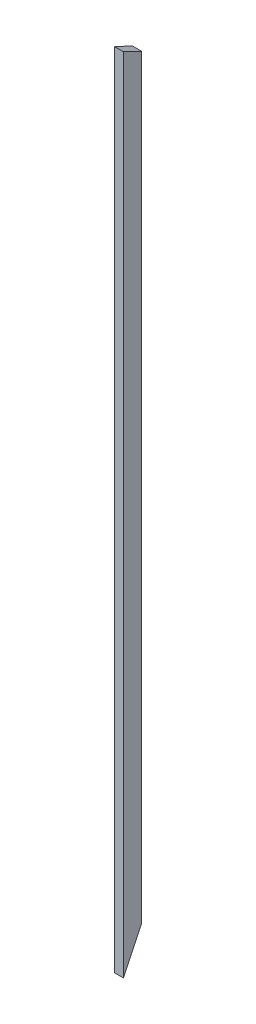
ISO-10303-21;
HEADER;
FILE_DESCRIPTION(('STEP AP214'),'2;1');
FILE_NAME('part.step','',(''),(''),'','','');
FILE_SCHEMA(('AUTOMOTIVE_DESIGN { 1 0 10303 214 1 1 1 1 }'));
ENDSEC;
DATA;
#1=APPLICATION_CONTEXT('core data for automotive mechanical design processes');
#2=APPLICATION_PROTOCOL_DEFINITION('international standard','automotive_design',2000,#1);
#3=PRODUCT_CONTEXT('',#1,'mechanical');
#4=PRODUCT('Part','Part','',(#3));
#5=PRODUCT_RELATED_PRODUCT_CATEGORY('part','',(#4));
#6=PRODUCT_DEFINITION_FORMATION('','',#4);
#7=PRODUCT_DEFINITION_CONTEXT('part definition',#1,'design');
#8=PRODUCT_DEFINITION('design','',#6,#7);
#9=PRODUCT_DEFINITION_SHAPE('','',#8);
#10=(LENGTH_UNIT() NAMED_UNIT(*) SI_UNIT(.MILLI.,.METRE.));
#11=(NAMED_UNIT(*) PLANE_ANGLE_UNIT() SI_UNIT($,.RADIAN.));
#12=(NAMED_UNIT(*) SI_UNIT($,.STERADIAN.) SOLID_ANGLE_UNIT());
#13=UNCERTAINTY_MEASURE_WITH_UNIT(LENGTH_MEASURE(1.E-05),#10,'distance_accuracy_value','');
#14=(GEOMETRIC_REPRESENTATION_CONTEXT(3) GLOBAL_UNCERTAINTY_ASSIGNED_CONTEXT((#13)) GLOBAL_UNIT_ASSIGNED_CONTEXT((#10,
#11,#12)) REPRESENTATION_CONTEXT('',''));
#15=CARTESIAN_POINT('',(0.,0.,0.));
#16=DIRECTION('',(0.,0.,1.));
#17=DIRECTION('',(1.,0.,0.));
#18=AXIS2_PLACEMENT_3D('',#15,#16,#17);
#19=CARTESIAN_POINT('',(-12.5,2214.15898255,-25.));
#20=DIRECTION('',(1.,0.,0.));
#21=DIRECTION('',(0.,0.,-1.));
#22=AXIS2_PLACEMENT_3D('',#19,#20,#21);
#23=PLANE('',#22);
#24=DIRECTION('',(0.,-1.,0.));
#25=VECTOR('',#24,1.);
#26=CARTESIAN_POINT('',(-12.5,2214.15898255,25.));
#27=LINE('',#26,#25);
#28=CARTESIAN_POINT('',(-12.5,2214.15898255,25.));
#29=VERTEX_POINT('',#28);
#30=CARTESIAN_POINT('',(-12.5,0.,25.));
#31=VERTEX_POINT('',#30);
#32=EDGE_CURVE('E11',#29,#31,#27,.T.);
#33=ORIENTED_EDGE('',*,*,#32,.F.);
#34=DIRECTION('',(0.,0.428920235500563,0.903342366757002));
#35=VECTOR('',#34,1.);
#36=CARTESIAN_POINT('',(-12.5,2214.15898255,25.));
#37=LINE('',#36,#35);
#38=CARTESIAN_POINT('',(-12.5,2190.41824751504,-25.));
#39=VERTEX_POINT('',#38);
#40=EDGE_CURVE('E57',#39,#29,#37,.T.);
#41=ORIENTED_EDGE('',*,*,#40,.F.);
#42=DIRECTION('',(0.,-1.,0.));
#43=VECTOR('',#42,1.);
#44=CARTESIAN_POINT('',(-12.5,2214.15898255,-25.));
#45=LINE('',#44,#43);
#46=CARTESIAN_POINT('',(-12.5,105.257973094678,-25.));
#47=VERTEX_POINT('',#46);
#48=EDGE_CURVE('E89',#39,#47,#45,.T.);
#49=ORIENTED_EDGE('',*,*,#48,.T.);
#50=DIRECTION('',(0.,0.903269313435838,-0.429074058182442));
#51=VECTOR('',#50,1.);
#52=CARTESIAN_POINT('',(-12.5,0.,25.));
#53=LINE('',#52,#51);
#54=EDGE_CURVE('E122',#31,#47,#53,.T.);
#55=ORIENTED_EDGE('',*,*,#54,.F.);
#56=EDGE_LOOP('',(#33,#41,#49,#55));
#57=FACE_BOUND('',#56,.T.);
#58=ADVANCED_FACE('F42',(#57),#23,.F.);
#59=CARTESIAN_POINT('',(12.5,2214.15898255,25.));
#60=DIRECTION('',(0.,0.,-1.));
#61=DIRECTION('',(-1.,0.,0.));
#62=AXIS2_PLACEMENT_3D('',#59,#60,#61);
#63=PLANE('',#62);
#64=DIRECTION('',(1.,0.,0.));
#65=VECTOR('',#64,1.);
#66=CARTESIAN_POINT('',(12.5,0.,25.));
#67=LINE('',#66,#65);
#68=CARTESIAN_POINT('',(12.5,0.,25.));
#69=VERTEX_POINT('',#68);
#70=EDGE_CURVE('E104',#31,#69,#67,.T.);
#71=ORIENTED_EDGE('',*,*,#70,.T.);
#72=DIRECTION('',(0.,-1.,0.));
#73=VECTOR('',#72,1.);
#74=CARTESIAN_POINT('',(12.5,2214.15898255,25.));
#75=LINE('',#74,#73);
#76=CARTESIAN_POINT('',(12.5,2214.15898255,25.));
#77=VERTEX_POINT('',#76);
#78=EDGE_CURVE('E51',#77,#69,#75,.T.);
#79=ORIENTED_EDGE('',*,*,#78,.F.);
#80=DIRECTION('',(1.,0.,0.));
#81=VECTOR('',#80,1.);
#82=CARTESIAN_POINT('',(12.5,2214.15898255,25.));
#83=LINE('',#82,#81);
#84=EDGE_CURVE('E99',#29,#77,#83,.T.);
#85=ORIENTED_EDGE('',*,*,#84,.F.);
#86=ORIENTED_EDGE('',*,*,#32,.T.);
#87=EDGE_LOOP('',(#71,#79,#85,#86));
#88=FACE_BOUND('',#87,.T.);
#89=ADVANCED_FACE('F116',(#88),#63,.F.);
#90=CARTESIAN_POINT('',(12.5,2214.15898255,-25.));
#91=DIRECTION('',(-1.,0.,0.));
#92=DIRECTION('',(0.,0.,1.));
#93=AXIS2_PLACEMENT_3D('',#90,#91,#92);
#94=PLANE('',#93);
#95=DIRECTION('',(0.,-1.,0.));
#96=VECTOR('',#95,1.);
#97=CARTESIAN_POINT('',(12.5,2214.15898255,-25.));
#98=LINE('',#97,#96);
#99=CARTESIAN_POINT('',(12.5,2190.41824751504,-25.));
#100=VERTEX_POINT('',#99);
#101=CARTESIAN_POINT('',(12.5,105.257973094678,-25.));
#102=VERTEX_POINT('',#101);
#103=EDGE_CURVE('E98',#100,#102,#98,.T.);
#104=ORIENTED_EDGE('',*,*,#103,.F.);
#105=DIRECTION('',(0.,0.428920235500563,0.903342366757002));
#106=VECTOR('',#105,1.);
#107=CARTESIAN_POINT('',(12.5,2194.78589151565,-15.8013715789071));
#108=LINE('',#107,#106);
#109=EDGE_CURVE('E80',#100,#77,#108,.T.);
#110=ORIENTED_EDGE('',*,*,#109,.T.);
#111=ORIENTED_EDGE('',*,*,#78,.T.);
#112=DIRECTION('',(0.,0.903269313435838,-0.429074058182442));
#113=VECTOR('',#112,1.);
#114=CARTESIAN_POINT('',(12.5,1825.90071668196,-842.345562050482));
#115=LINE('',#114,#113);
#116=EDGE_CURVE('E113',#69,#102,#115,.T.);
#117=ORIENTED_EDGE('',*,*,#116,.T.);
#118=EDGE_LOOP('',(#104,#110,#111,#117));
#119=FACE_BOUND('',#118,.T.);
#120=ADVANCED_FACE('F112',(#119),#94,.F.);
#121=CARTESIAN_POINT('',(12.5,2214.15898255,-25.));
#122=DIRECTION('',(0.,0.,1.));
#123=DIRECTION('',(1.,0.,0.));
#124=AXIS2_PLACEMENT_3D('',#121,#122,#123);
#125=PLANE('',#124);
#126=ORIENTED_EDGE('',*,*,#48,.F.);
#127=DIRECTION('',(-1.,0.,0.));
#128=VECTOR('',#127,1.);
#129=CARTESIAN_POINT('',(37.5,2190.41824751504,-25.));
#130=LINE('',#129,#128);
#131=EDGE_CURVE('E77',#100,#39,#130,.T.);
#132=ORIENTED_EDGE('',*,*,#131,.F.);
#133=ORIENTED_EDGE('',*,*,#103,.T.);
#134=DIRECTION('',(-1.,0.,0.));
#135=VECTOR('',#134,1.);
#136=CARTESIAN_POINT('',(37.5,105.257973094678,-25.));
#137=LINE('',#136,#135);
#138=EDGE_CURVE('E96',#102,#47,#137,.T.);
#139=ORIENTED_EDGE('',*,*,#138,.T.);
#140=EDGE_LOOP('',(#126,#132,#133,#139));
#141=FACE_BOUND('',#140,.T.);
#142=ADVANCED_FACE('F94',(#141),#125,.F.);
#143=CARTESIAN_POINT('',(37.5,0.,25.));
#144=DIRECTION('',(0.,0.429074058182442,0.903269313435838));
#145=DIRECTION('',(0.,-0.903269313435838,0.429074058182442));
#146=AXIS2_PLACEMENT_3D('',#143,#144,#145);
#147=PLANE('',#146);
#148=ORIENTED_EDGE('',*,*,#70,.F.);
#149=ORIENTED_EDGE('',*,*,#54,.T.);
#150=ORIENTED_EDGE('',*,*,#138,.F.);
#151=ORIENTED_EDGE('',*,*,#116,.F.);
#152=EDGE_LOOP('',(#148,#149,#150,#151));
#153=FACE_BOUND('',#152,.T.);
#154=ADVANCED_FACE('F128',(#153),#147,.F.);
#155=CARTESIAN_POINT('',(37.5,2214.15898255,25.));
#156=DIRECTION('',(0.,-0.903342366757002,0.428920235500563));
#157=DIRECTION('',(0.,-0.428920235500563,-0.903342366757002));
#158=AXIS2_PLACEMENT_3D('',#155,#156,#157);
#159=PLANE('',#158);
#160=ORIENTED_EDGE('',*,*,#131,.T.);
#161=ORIENTED_EDGE('',*,*,#40,.T.);
#162=ORIENTED_EDGE('',*,*,#84,.T.);
#163=ORIENTED_EDGE('',*,*,#109,.F.);
#164=EDGE_LOOP('',(#160,#161,#162,#163));
#165=FACE_BOUND('',#164,.T.);
#166=ADVANCED_FACE('F78',(#165),#159,.F.);
#167=CLOSED_SHELL('',(#58,#89,#120,#142,#154,#166));
#168=MANIFOLD_SOLID_BREP('B2',#167);
#169=ADVANCED_BREP_SHAPE_REPRESENTATION('',(#18,#168),#14);
#170=SHAPE_DEFINITION_REPRESENTATION(#9,#169);
ENDSEC;
END-ISO-10303-21;
